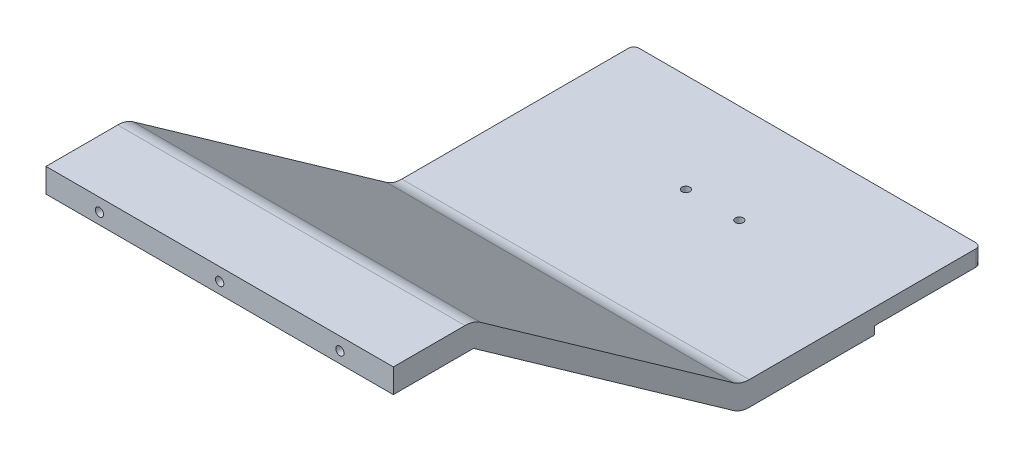
ISO-10303-21;
HEADER;
FILE_DESCRIPTION(('STEP AP214'),'2;1');
FILE_NAME('part.step','',(''),(''),'','','');
FILE_SCHEMA(('AUTOMOTIVE_DESIGN { 1 0 10303 214 1 1 1 1 }'));
ENDSEC;
DATA;
#1=APPLICATION_CONTEXT('core data for automotive mechanical design processes');
#2=APPLICATION_PROTOCOL_DEFINITION('international standard','automotive_design',2000,#1);
#3=PRODUCT_CONTEXT('',#1,'mechanical');
#4=PRODUCT('Part','Part','',(#3));
#5=PRODUCT_RELATED_PRODUCT_CATEGORY('part','',(#4));
#6=PRODUCT_DEFINITION_FORMATION('','',#4);
#7=PRODUCT_DEFINITION_CONTEXT('part definition',#1,'design');
#8=PRODUCT_DEFINITION('design','',#6,#7);
#9=PRODUCT_DEFINITION_SHAPE('','',#8);
#10=(LENGTH_UNIT() NAMED_UNIT(*) SI_UNIT(.MILLI.,.METRE.));
#11=(NAMED_UNIT(*) PLANE_ANGLE_UNIT() SI_UNIT($,.RADIAN.));
#12=(NAMED_UNIT(*) SI_UNIT($,.STERADIAN.) SOLID_ANGLE_UNIT());
#13=UNCERTAINTY_MEASURE_WITH_UNIT(LENGTH_MEASURE(1.E-05),#10,'distance_accuracy_value','');
#14=(GEOMETRIC_REPRESENTATION_CONTEXT(3) GLOBAL_UNCERTAINTY_ASSIGNED_CONTEXT((#13)) GLOBAL_UNIT_ASSIGNED_CONTEXT((#10,
#11,#12)) REPRESENTATION_CONTEXT('',''));
#15=CARTESIAN_POINT('',(0.,0.,0.));
#16=DIRECTION('',(0.,0.,1.));
#17=DIRECTION('',(1.,0.,0.));
#18=AXIS2_PLACEMENT_3D('',#15,#16,#17);
#19=CARTESIAN_POINT('',(209.,70.,-50.));
#20=DIRECTION('',(0.,0.,1.));
#21=DIRECTION('',(1.,0.,0.));
#22=AXIS2_PLACEMENT_3D('',#19,#20,#21);
#23=PLANE('',#22);
#24=DIRECTION('',(0.,1.,0.));
#25=VECTOR('',#24,1.);
#26=CARTESIAN_POINT('',(79.,70.,-50.));
#27=LINE('',#26,#25);
#28=CARTESIAN_POINT('',(79.,70.,-50.));
#29=VERTEX_POINT('',#28);
#30=CARTESIAN_POINT('',(79.,73.,-50.));
#31=VERTEX_POINT('',#30);
#32=EDGE_CURVE('E190',#29,#31,#27,.T.);
#33=ORIENTED_EDGE('',*,*,#32,.T.);
#34=DIRECTION('',(-1.,0.,0.));
#35=VECTOR('',#34,1.);
#36=CARTESIAN_POINT('',(209.,73.,-50.));
#37=LINE('',#36,#35);
#38=CARTESIAN_POINT('',(209.,73.,-50.));
#39=VERTEX_POINT('',#38);
#40=EDGE_CURVE('E252',#39,#31,#37,.T.);
#41=ORIENTED_EDGE('',*,*,#40,.F.);
#42=DIRECTION('',(0.,1.,0.));
#43=VECTOR('',#42,1.);
#44=CARTESIAN_POINT('',(209.,70.,-50.));
#45=LINE('',#44,#43);
#46=CARTESIAN_POINT('',(209.,70.,-50.));
#47=VERTEX_POINT('',#46);
#48=EDGE_CURVE('E198',#47,#39,#45,.T.);
#49=ORIENTED_EDGE('',*,*,#48,.F.);
#50=DIRECTION('',(-1.,0.,0.));
#51=VECTOR('',#50,1.);
#52=CARTESIAN_POINT('',(209.,70.,-50.));
#53=LINE('',#52,#51);
#54=EDGE_CURVE('E212',#47,#29,#53,.T.);
#55=ORIENTED_EDGE('',*,*,#54,.T.);
#56=EDGE_LOOP('',(#33,#41,#49,#55));
#57=FACE_BOUND('',#56,.T.);
#58=ADVANCED_FACE('F57',(#57),#23,.F.);
#59=CARTESIAN_POINT('',(209.,73.,-50.));
#60=DIRECTION('',(0.,1.,0.));
#61=DIRECTION('',(0.,0.,1.));
#62=AXIS2_PLACEMENT_3D('',#59,#60,#61);
#63=PLANE('',#62);
#64=CARTESIAN_POINT('',(135.5,73.,-53.));
#65=DIRECTION('',(0.,-1.,0.));
#66=DIRECTION('',(0.,0.,-1.));
#67=AXIS2_PLACEMENT_3D('',#64,#65,#66);
#68=CIRCLE('',#67,1.5);
#69=CARTESIAN_POINT('',(135.5,73.,-54.5));
#70=VERTEX_POINT('',#69);
#71=EDGE_CURVE('E278',#70,#70,#68,.T.);
#72=ORIENTED_EDGE('',*,*,#71,.F.);
#73=EDGE_LOOP('',(#72));
#74=FACE_BOUND('',#73,.T.);
#75=CARTESIAN_POINT('',(155.5,73.,-53.));
#76=DIRECTION('',(0.,-1.,0.));
#77=DIRECTION('',(0.,0.,-1.));
#78=AXIS2_PLACEMENT_3D('',#75,#76,#77);
#79=CIRCLE('',#78,1.5);
#80=CARTESIAN_POINT('',(155.5,73.,-54.5));
#81=VERTEX_POINT('',#80);
#82=EDGE_CURVE('E557',#81,#81,#79,.T.);
#83=ORIENTED_EDGE('',*,*,#82,.F.);
#84=EDGE_LOOP('',(#83));
#85=FACE_BOUND('',#84,.T.);
#86=DIRECTION('',(-1.,0.,0.));
#87=VECTOR('',#86,1.);
#88=CARTESIAN_POINT('',(209.,73.,-90.));
#89=LINE('',#88,#87);
#90=CARTESIAN_POINT('',(207.,73.,-90.));
#91=VERTEX_POINT('',#90);
#92=CARTESIAN_POINT('',(81.,73.,-90.));
#93=VERTEX_POINT('',#92);
#94=EDGE_CURVE('E247',#91,#93,#89,.T.);
#95=ORIENTED_EDGE('',*,*,#94,.F.);
#96=CARTESIAN_POINT('',(207.,73.,-88.));
#97=DIRECTION('',(0.,1.,0.));
#98=DIRECTION('',(0.,0.,1.));
#99=AXIS2_PLACEMENT_3D('',#96,#97,#98);
#100=CIRCLE('',#99,2.);
#101=CARTESIAN_POINT('',(209.,73.,-88.));
#102=VERTEX_POINT('',#101);
#103=EDGE_CURVE('E266',#91,#102,#100,.F.);
#104=ORIENTED_EDGE('',*,*,#103,.T.);
#105=DIRECTION('',(0.,0.,-1.));
#106=VECTOR('',#105,1.);
#107=CARTESIAN_POINT('',(209.,73.,-50.));
#108=LINE('',#107,#106);
#109=EDGE_CURVE('E200',#39,#102,#108,.T.);
#110=ORIENTED_EDGE('',*,*,#109,.F.);
#111=ORIENTED_EDGE('',*,*,#40,.T.);
#112=DIRECTION('',(0.,0.,-1.));
#113=VECTOR('',#112,1.);
#114=CARTESIAN_POINT('',(79.,73.,-50.));
#115=LINE('',#114,#113);
#116=CARTESIAN_POINT('',(79.,73.,-88.));
#117=VERTEX_POINT('',#116);
#118=EDGE_CURVE('E188',#31,#117,#115,.T.);
#119=ORIENTED_EDGE('',*,*,#118,.T.);
#120=CARTESIAN_POINT('',(81.,73.,-88.));
#121=DIRECTION('',(0.,1.,0.));
#122=DIRECTION('',(0.,0.,1.));
#123=AXIS2_PLACEMENT_3D('',#120,#121,#122);
#124=CIRCLE('',#123,2.);
#125=EDGE_CURVE('E268',#117,#93,#124,.F.);
#126=ORIENTED_EDGE('',*,*,#125,.T.);
#127=EDGE_LOOP('',(#95,#104,#110,#111,#119,#126));
#128=FACE_BOUND('',#127,.T.);
#129=ADVANCED_FACE('F321',(#74,#85,#128),#63,.F.);
#130=CARTESIAN_POINT('',(209.,73.,-90.));
#131=DIRECTION('',(0.,0.,1.));
#132=DIRECTION('',(1.,0.,0.));
#133=AXIS2_PLACEMENT_3D('',#130,#131,#132);
#134=PLANE('',#133);
#135=DIRECTION('',(-1.,0.,0.));
#136=VECTOR('',#135,1.);
#137=CARTESIAN_POINT('',(209.,79.,-90.));
#138=LINE('',#137,#136);
#139=CARTESIAN_POINT('',(207.,79.,-90.));
#140=VERTEX_POINT('',#139);
#141=CARTESIAN_POINT('',(81.,79.,-90.));
#142=VERTEX_POINT('',#141);
#143=EDGE_CURVE('E244',#140,#142,#138,.T.);
#144=ORIENTED_EDGE('',*,*,#143,.F.);
#145=DIRECTION('',(0.,1.,0.));
#146=VECTOR('',#145,1.);
#147=CARTESIAN_POINT('',(207.,73.,-90.));
#148=LINE('',#147,#146);
#149=EDGE_CURVE('E265',#140,#91,#148,.F.);
#150=ORIENTED_EDGE('',*,*,#149,.T.);
#151=ORIENTED_EDGE('',*,*,#94,.T.);
#152=DIRECTION('',(0.,1.,0.));
#153=VECTOR('',#152,1.);
#154=CARTESIAN_POINT('',(81.,73.,-90.));
#155=LINE('',#154,#153);
#156=EDGE_CURVE('E263',#93,#142,#155,.T.);
#157=ORIENTED_EDGE('',*,*,#156,.T.);
#158=EDGE_LOOP('',(#144,#150,#151,#157));
#159=FACE_BOUND('',#158,.T.);
#160=ADVANCED_FACE('F357',(#159),#134,.F.);
#161=CARTESIAN_POINT('',(209.,79.,-90.));
#162=DIRECTION('',(0.,-1.,0.));
#163=DIRECTION('',(0.,0.,-1.));
#164=AXIS2_PLACEMENT_3D('',#161,#162,#163);
#165=PLANE('',#164);
#166=CARTESIAN_POINT('',(135.5,79.,-53.));
#167=DIRECTION('',(0.,-1.,0.));
#168=DIRECTION('',(0.,0.,-1.));
#169=AXIS2_PLACEMENT_3D('',#166,#167,#168);
#170=CIRCLE('',#169,1.5);
#171=CARTESIAN_POINT('',(135.5,79.,-54.5));
#172=VERTEX_POINT('',#171);
#173=EDGE_CURVE('E273',#172,#172,#170,.T.);
#174=ORIENTED_EDGE('',*,*,#173,.T.);
#175=EDGE_LOOP('',(#174));
#176=FACE_BOUND('',#175,.T.);
#177=CARTESIAN_POINT('',(155.5,79.,-53.));
#178=DIRECTION('',(0.,-1.,0.));
#179=DIRECTION('',(0.,0.,-1.));
#180=AXIS2_PLACEMENT_3D('',#177,#178,#179);
#181=CIRCLE('',#180,1.5);
#182=CARTESIAN_POINT('',(155.5,79.,-54.5));
#183=VERTEX_POINT('',#182);
#184=EDGE_CURVE('E275',#183,#183,#181,.T.);
#185=ORIENTED_EDGE('',*,*,#184,.T.);
#186=EDGE_LOOP('',(#185));
#187=FACE_BOUND('',#186,.T.);
#188=DIRECTION('',(0.,0.,1.));
#189=VECTOR('',#188,1.);
#190=CARTESIAN_POINT('',(209.,79.,-90.));
#191=LINE('',#190,#189);
#192=CARTESIAN_POINT('',(209.,79.,-88.));
#193=VERTEX_POINT('',#192);
#194=CARTESIAN_POINT('',(209.,79.,-3.17837245195783));
#195=VERTEX_POINT('',#194);
#196=EDGE_CURVE('E201',#193,#195,#191,.T.);
#197=ORIENTED_EDGE('',*,*,#196,.F.);
#198=CARTESIAN_POINT('',(207.,79.,-88.));
#199=DIRECTION('',(0.,-1.,0.));
#200=DIRECTION('',(0.,0.,-1.));
#201=AXIS2_PLACEMENT_3D('',#198,#199,#200);
#202=CIRCLE('',#201,2.);
#203=EDGE_CURVE('E257',#193,#140,#202,.F.);
#204=ORIENTED_EDGE('',*,*,#203,.T.);
#205=ORIENTED_EDGE('',*,*,#143,.T.);
#206=CARTESIAN_POINT('',(81.,79.,-88.));
#207=DIRECTION('',(0.,-1.,0.));
#208=DIRECTION('',(0.,0.,-1.));
#209=AXIS2_PLACEMENT_3D('',#206,#207,#208);
#210=CIRCLE('',#209,2.);
#211=CARTESIAN_POINT('',(79.,79.,-88.));
#212=VERTEX_POINT('',#211);
#213=EDGE_CURVE('E260',#142,#212,#210,.F.);
#214=ORIENTED_EDGE('',*,*,#213,.T.);
#215=DIRECTION('',(0.,0.,1.));
#216=VECTOR('',#215,1.);
#217=CARTESIAN_POINT('',(79.,79.,-90.));
#218=LINE('',#217,#216);
#219=CARTESIAN_POINT('',(79.,79.,-3.17837245195783));
#220=VERTEX_POINT('',#219);
#221=EDGE_CURVE('E217',#212,#220,#218,.T.);
#222=ORIENTED_EDGE('',*,*,#221,.T.);
#223=DIRECTION('',(-1.,0.,0.));
#224=VECTOR('',#223,1.);
#225=CARTESIAN_POINT('',(209.,79.,-3.17837245195783));
#226=LINE('',#225,#224);
#227=EDGE_CURVE('E245',#195,#220,#226,.T.);
#228=ORIENTED_EDGE('',*,*,#227,.F.);
#229=EDGE_LOOP('',(#197,#204,#205,#214,#222,#228));
#230=FACE_BOUND('',#229,.T.);
#231=ADVANCED_FACE('F335',(#176,#187,#230),#165,.F.);
#232=CARTESIAN_POINT('',(209.,89.,-3.17837245195783));
#233=DIRECTION('',(-1.,0.,0.));
#234=DIRECTION('',(0.,0.,1.));
#235=AXIS2_PLACEMENT_3D('',#232,#233,#234);
#236=CYLINDRICAL_SURFACE('',#235,10.);
#237=CARTESIAN_POINT('',(79.,89.,-3.17837245195783));
#238=DIRECTION('',(-1.,0.,0.));
#239=DIRECTION('',(0.,0.,-1.));
#240=AXIS2_PLACEMENT_3D('',#237,#238,#239);
#241=CIRCLE('',#240,10.);
#242=CARTESIAN_POINT('',(79.,80.8350341907227,2.59513023993843));
#243=VERTEX_POINT('',#242);
#244=EDGE_CURVE('E216',#220,#243,#241,.T.);
#245=ORIENTED_EDGE('',*,*,#244,.T.);
#246=DIRECTION('',(-1.,0.,0.));
#247=VECTOR('',#246,1.);
#248=CARTESIAN_POINT('',(209.,80.8350341907227,2.59513023993843));
#249=LINE('',#248,#247);
#250=CARTESIAN_POINT('',(209.,80.8350341907227,2.59513023993843));
#251=VERTEX_POINT('',#250);
#252=EDGE_CURVE('E237',#251,#243,#249,.T.);
#253=ORIENTED_EDGE('',*,*,#252,.F.);
#254=CARTESIAN_POINT('',(209.,89.,-3.17837245195783));
#255=DIRECTION('',(-1.,0.,0.));
#256=DIRECTION('',(0.,0.,-1.));
#257=AXIS2_PLACEMENT_3D('',#254,#255,#256);
#258=CIRCLE('',#257,10.);
#259=EDGE_CURVE('E202',#195,#251,#258,.T.);
#260=ORIENTED_EDGE('',*,*,#259,.F.);
#261=ORIENTED_EDGE('',*,*,#227,.T.);
#262=EDGE_LOOP('',(#245,#253,#260,#261));
#263=FACE_BOUND('',#262,.T.);
#264=ADVANCED_FACE('F339',(#263),#236,.F.);
#265=CARTESIAN_POINT('',(209.,80.8350341907227,2.59513023993843));
#266=DIRECTION('',(0.,-0.816496580927726,0.577350269189625));
#267=DIRECTION('',(0.,-0.577350269189625,-0.816496580927726));
#268=AXIS2_PLACEMENT_3D('',#265,#266,#267);
#269=PLANE('',#268);
#270=DIRECTION('',(0.,0.577350269189625,0.816496580927726));
#271=VECTOR('',#270,1.);
#272=CARTESIAN_POINT('',(79.,80.8350341907227,2.59513023993843));
#273=LINE('',#272,#271);
#274=CARTESIAN_POINT('',(79.,147.875643927932,97.4048697600616));
#275=VERTEX_POINT('',#274);
#276=EDGE_CURVE('E225',#243,#275,#273,.T.);
#277=ORIENTED_EDGE('',*,*,#276,.T.);
#278=DIRECTION('',(-1.,0.,0.));
#279=VECTOR('',#278,1.);
#280=CARTESIAN_POINT('',(209.,147.875643927932,97.4048697600616));
#281=LINE('',#280,#279);
#282=CARTESIAN_POINT('',(209.,147.875643927932,97.4048697600616));
#283=VERTEX_POINT('',#282);
#284=EDGE_CURVE('E62',#275,#283,#281,.F.);
#285=ORIENTED_EDGE('',*,*,#284,.T.);
#286=DIRECTION('',(0.,0.577350269189625,0.816496580927726));
#287=VECTOR('',#286,1.);
#288=CARTESIAN_POINT('',(209.,80.8350341907227,2.59513023993843));
#289=LINE('',#288,#287);
#290=EDGE_CURVE('E210',#251,#283,#289,.T.);
#291=ORIENTED_EDGE('',*,*,#290,.F.);
#292=ORIENTED_EDGE('',*,*,#252,.T.);
#293=EDGE_LOOP('',(#277,#285,#291,#292));
#294=FACE_BOUND('',#293,.T.);
#295=ADVANCED_FACE('F374',(#294),#269,.F.);
#296=CARTESIAN_POINT('',(209.,140.710678118655,100.));
#297=DIRECTION('',(0.,0.816496580927727,-0.577350269189625));
#298=DIRECTION('',(0.,0.577350269189625,0.816496580927727));
#299=AXIS2_PLACEMENT_3D('',#296,#297,#298);
#300=PLANE('',#299);
#301=DIRECTION('',(0.,-0.577350269189625,-0.816496580927727));
#302=VECTOR('',#301,1.);
#303=CARTESIAN_POINT('',(79.,140.710678118655,100.));
#304=LINE('',#303,#302);
#305=CARTESIAN_POINT('',(79.,140.710678118655,100.));
#306=VERTEX_POINT('',#305);
#307=CARTESIAN_POINT('',(79.,71.8350341907228,2.59513023993842));
#308=VERTEX_POINT('',#307);
#309=EDGE_CURVE('E224',#306,#308,#304,.T.);
#310=ORIENTED_EDGE('',*,*,#309,.T.);
#311=DIRECTION('',(-1.,0.,0.));
#312=VECTOR('',#311,1.);
#313=CARTESIAN_POINT('',(209.,71.8350341907228,2.59513023993842));
#314=LINE('',#313,#312);
#315=CARTESIAN_POINT('',(209.,71.8350341907228,2.59513023993842));
#316=VERTEX_POINT('',#315);
#317=EDGE_CURVE('E234',#316,#308,#314,.T.);
#318=ORIENTED_EDGE('',*,*,#317,.F.);
#319=DIRECTION('',(0.,-0.577350269189625,-0.816496580927727));
#320=VECTOR('',#319,1.);
#321=CARTESIAN_POINT('',(209.,140.710678118655,100.));
#322=LINE('',#321,#320);
#323=CARTESIAN_POINT('',(209.,140.710678118655,100.));
#324=VERTEX_POINT('',#323);
#325=EDGE_CURVE('E209',#324,#316,#322,.T.);
#326=ORIENTED_EDGE('',*,*,#325,.F.);
#327=DIRECTION('',(-1.,0.,0.));
#328=VECTOR('',#327,1.);
#329=CARTESIAN_POINT('',(209.,140.710678118655,100.));
#330=LINE('',#329,#328);
#331=EDGE_CURVE('E240',#324,#306,#330,.T.);
#332=ORIENTED_EDGE('',*,*,#331,.T.);
#333=EDGE_LOOP('',(#310,#318,#326,#332));
#334=FACE_BOUND('',#333,.T.);
#335=ADVANCED_FACE('F304',(#334),#300,.F.);
#336=CARTESIAN_POINT('',(209.,80.,-3.17837245195782));
#337=DIRECTION('',(-1.,0.,0.));
#338=DIRECTION('',(0.,0.,1.));
#339=AXIS2_PLACEMENT_3D('',#336,#337,#338);
#340=CYLINDRICAL_SURFACE('',#339,9.99999999999999);
#341=CARTESIAN_POINT('',(79.,80.,-3.17837245195782));
#342=DIRECTION('',(1.,0.,0.));
#343=DIRECTION('',(0.,0.,-1.));
#344=AXIS2_PLACEMENT_3D('',#341,#342,#343);
#345=CIRCLE('',#344,9.99999999999999);
#346=CARTESIAN_POINT('',(79.,70.,-3.17837245195782));
#347=VERTEX_POINT('',#346);
#348=EDGE_CURVE('E228',#308,#347,#345,.T.);
#349=ORIENTED_EDGE('',*,*,#348,.T.);
#350=DIRECTION('',(-1.,0.,0.));
#351=VECTOR('',#350,1.);
#352=CARTESIAN_POINT('',(209.,70.,-3.17837245195782));
#353=LINE('',#352,#351);
#354=CARTESIAN_POINT('',(209.,70.,-3.17837245195782));
#355=VERTEX_POINT('',#354);
#356=EDGE_CURVE('E233',#355,#347,#353,.T.);
#357=ORIENTED_EDGE('',*,*,#356,.F.);
#358=CARTESIAN_POINT('',(209.,80.,-3.17837245195782));
#359=DIRECTION('',(1.,0.,0.));
#360=DIRECTION('',(0.,0.,-1.));
#361=AXIS2_PLACEMENT_3D('',#358,#359,#360);
#362=CIRCLE('',#361,9.99999999999999);
#363=EDGE_CURVE('E213',#316,#355,#362,.T.);
#364=ORIENTED_EDGE('',*,*,#363,.F.);
#365=ORIENTED_EDGE('',*,*,#317,.T.);
#366=EDGE_LOOP('',(#349,#357,#364,#365));
#367=FACE_BOUND('',#366,.T.);
#368=ADVANCED_FACE('F311',(#367),#340,.T.);
#369=CARTESIAN_POINT('',(209.,70.,-3.17837245195782));
#370=DIRECTION('',(0.,1.,0.));
#371=DIRECTION('',(0.,0.,1.));
#372=AXIS2_PLACEMENT_3D('',#369,#370,#371);
#373=PLANE('',#372);
#374=DIRECTION('',(0.,0.,-1.));
#375=VECTOR('',#374,1.);
#376=CARTESIAN_POINT('',(79.,70.,-3.17837245195782));
#377=LINE('',#376,#375);
#378=EDGE_CURVE('E196',#347,#29,#377,.T.);
#379=ORIENTED_EDGE('',*,*,#378,.T.);
#380=ORIENTED_EDGE('',*,*,#54,.F.);
#381=DIRECTION('',(0.,0.,-1.));
#382=VECTOR('',#381,1.);
#383=CARTESIAN_POINT('',(209.,70.,-3.17837245195782));
#384=LINE('',#383,#382);
#385=EDGE_CURVE('E211',#355,#47,#384,.T.);
#386=ORIENTED_EDGE('',*,*,#385,.F.);
#387=ORIENTED_EDGE('',*,*,#356,.T.);
#388=EDGE_LOOP('',(#379,#380,#386,#387));
#389=FACE_BOUND('',#388,.T.);
#390=ADVANCED_FACE('F314',(#389),#373,.F.);
#391=CARTESIAN_POINT('',(209.,89.,-3.17837245195783));
#392=DIRECTION('',(1.,0.,0.));
#393=DIRECTION('',(0.,0.,-1.));
#394=AXIS2_PLACEMENT_3D('',#391,#392,#393);
#395=PLANE('',#394);
#396=ORIENTED_EDGE('',*,*,#290,.T.);
#397=CARTESIAN_POINT('',(209.,139.710678118655,103.178372451958));
#398=DIRECTION('',(1.,0.,0.));
#399=DIRECTION('',(0.,0.,-1.));
#400=AXIS2_PLACEMENT_3D('',#397,#398,#399);
#401=CIRCLE('',#400,10.);
#402=CARTESIAN_POINT('',(209.,149.710678118655,103.178372451958));
#403=VERTEX_POINT('',#402);
#404=EDGE_CURVE('E12',#283,#403,#401,.T.);
#405=ORIENTED_EDGE('',*,*,#404,.T.);
#406=DIRECTION('',(0.,0.,-1.));
#407=VECTOR('',#406,1.);
#408=CARTESIAN_POINT('',(209.,149.710678118655,130.));
#409=LINE('',#408,#407);
#410=CARTESIAN_POINT('',(209.,149.710678118655,130.));
#411=VERTEX_POINT('',#410);
#412=EDGE_CURVE('E294',#411,#403,#409,.T.);
#413=ORIENTED_EDGE('',*,*,#412,.F.);
#414=DIRECTION('',(0.,1.,0.));
#415=VECTOR('',#414,1.);
#416=CARTESIAN_POINT('',(209.,140.710678118655,130.));
#417=LINE('',#416,#415);
#418=CARTESIAN_POINT('',(209.,140.710678118655,130.));
#419=VERTEX_POINT('',#418);
#420=EDGE_CURVE('E180',#419,#411,#417,.T.);
#421=ORIENTED_EDGE('',*,*,#420,.F.);
#422=DIRECTION('',(0.,0.,-1.));
#423=VECTOR('',#422,1.);
#424=CARTESIAN_POINT('',(209.,140.710678118655,130.));
#425=LINE('',#424,#423);
#426=EDGE_CURVE('E195',#419,#324,#425,.T.);
#427=ORIENTED_EDGE('',*,*,#426,.T.);
#428=ORIENTED_EDGE('',*,*,#325,.T.);
#429=ORIENTED_EDGE('',*,*,#363,.T.);
#430=ORIENTED_EDGE('',*,*,#385,.T.);
#431=ORIENTED_EDGE('',*,*,#48,.T.);
#432=ORIENTED_EDGE('',*,*,#109,.T.);
#433=DIRECTION('',(0.,1.,0.));
#434=VECTOR('',#433,1.);
#435=CARTESIAN_POINT('',(209.,79.,-88.));
#436=LINE('',#435,#434);
#437=EDGE_CURVE('E251',#102,#193,#436,.T.);
#438=ORIENTED_EDGE('',*,*,#437,.T.);
#439=ORIENTED_EDGE('',*,*,#196,.T.);
#440=ORIENTED_EDGE('',*,*,#259,.T.);
#441=EDGE_LOOP('',(#396,#405,#413,#421,#427,#428,#429,#430,#431,#432,#438,#439,#440));
#442=FACE_BOUND('',#441,.T.);
#443=ADVANCED_FACE('F299',(#442),#395,.T.);
#444=CARTESIAN_POINT('',(79.,89.,-3.17837245195783));
#445=DIRECTION('',(1.,0.,0.));
#446=DIRECTION('',(0.,0.,-1.));
#447=AXIS2_PLACEMENT_3D('',#444,#445,#446);
#448=PLANE('',#447);
#449=DIRECTION('',(0.,0.,-1.));
#450=VECTOR('',#449,1.);
#451=CARTESIAN_POINT('',(79.,149.710678118655,130.));
#452=LINE('',#451,#450);
#453=CARTESIAN_POINT('',(79.,149.710678118655,130.));
#454=VERTEX_POINT('',#453);
#455=CARTESIAN_POINT('',(79.,149.710678118655,103.178372451958));
#456=VERTEX_POINT('',#455);
#457=EDGE_CURVE('E164',#454,#456,#452,.T.);
#458=ORIENTED_EDGE('',*,*,#457,.T.);
#459=CARTESIAN_POINT('',(79.,139.710678118655,103.178372451958));
#460=DIRECTION('',(1.,0.,0.));
#461=DIRECTION('',(0.,0.,-1.));
#462=AXIS2_PLACEMENT_3D('',#459,#460,#461);
#463=CIRCLE('',#462,10.);
#464=EDGE_CURVE('E76',#456,#275,#463,.F.);
#465=ORIENTED_EDGE('',*,*,#464,.T.);
#466=ORIENTED_EDGE('',*,*,#276,.F.);
#467=ORIENTED_EDGE('',*,*,#244,.F.);
#468=ORIENTED_EDGE('',*,*,#221,.F.);
#469=DIRECTION('',(0.,1.,0.));
#470=VECTOR('',#469,1.);
#471=CARTESIAN_POINT('',(79.,89.,-88.));
#472=LINE('',#471,#470);
#473=EDGE_CURVE('E267',#212,#117,#472,.F.);
#474=ORIENTED_EDGE('',*,*,#473,.T.);
#475=ORIENTED_EDGE('',*,*,#118,.F.);
#476=ORIENTED_EDGE('',*,*,#32,.F.);
#477=ORIENTED_EDGE('',*,*,#378,.F.);
#478=ORIENTED_EDGE('',*,*,#348,.F.);
#479=ORIENTED_EDGE('',*,*,#309,.F.);
#480=DIRECTION('',(0.,0.,-1.));
#481=VECTOR('',#480,1.);
#482=CARTESIAN_POINT('',(79.,140.710678118655,130.));
#483=LINE('',#482,#481);
#484=CARTESIAN_POINT('',(79.,140.710678118655,130.));
#485=VERTEX_POINT('',#484);
#486=EDGE_CURVE('E166',#485,#306,#483,.T.);
#487=ORIENTED_EDGE('',*,*,#486,.F.);
#488=DIRECTION('',(0.,-1.,0.));
#489=VECTOR('',#488,1.);
#490=CARTESIAN_POINT('',(79.,149.710678118655,130.));
#491=LINE('',#490,#489);
#492=EDGE_CURVE('E163',#454,#485,#491,.T.);
#493=ORIENTED_EDGE('',*,*,#492,.F.);
#494=EDGE_LOOP('',(#458,#465,#466,#467,#468,#474,#475,#476,#477,#478,#479,#487,#493));
#495=FACE_BOUND('',#494,.T.);
#496=ADVANCED_FACE('F161',(#495),#448,.F.);
#497=CARTESIAN_POINT('',(209.,149.710678118655,130.));
#498=DIRECTION('',(0.,-1.,0.));
#499=DIRECTION('',(0.,0.,-1.));
#500=AXIS2_PLACEMENT_3D('',#497,#498,#499);
#501=PLANE('',#500);
#502=ORIENTED_EDGE('',*,*,#412,.T.);
#503=DIRECTION('',(-1.,0.,0.));
#504=VECTOR('',#503,1.);
#505=CARTESIAN_POINT('',(209.,149.710678118655,103.178372451958));
#506=LINE('',#505,#504);
#507=EDGE_CURVE('E187',#403,#456,#506,.T.);
#508=ORIENTED_EDGE('',*,*,#507,.T.);
#509=ORIENTED_EDGE('',*,*,#457,.F.);
#510=DIRECTION('',(-1.,0.,0.));
#511=VECTOR('',#510,1.);
#512=CARTESIAN_POINT('',(209.,149.710678118655,130.));
#513=LINE('',#512,#511);
#514=EDGE_CURVE('E175',#411,#454,#513,.T.);
#515=ORIENTED_EDGE('',*,*,#514,.F.);
#516=EDGE_LOOP('',(#502,#508,#509,#515));
#517=FACE_BOUND('',#516,.T.);
#518=ADVANCED_FACE('F183',(#517),#501,.F.);
#519=CARTESIAN_POINT('',(79.,140.710678118655,130.));
#520=DIRECTION('',(0.,1.,0.));
#521=DIRECTION('',(0.,0.,1.));
#522=AXIS2_PLACEMENT_3D('',#519,#520,#521);
#523=PLANE('',#522);
#524=ORIENTED_EDGE('',*,*,#331,.F.);
#525=ORIENTED_EDGE('',*,*,#426,.F.);
#526=DIRECTION('',(1.,0.,0.));
#527=VECTOR('',#526,1.);
#528=CARTESIAN_POINT('',(79.,140.710678118655,130.));
#529=LINE('',#528,#527);
#530=EDGE_CURVE('E171',#485,#419,#529,.T.);
#531=ORIENTED_EDGE('',*,*,#530,.F.);
#532=ORIENTED_EDGE('',*,*,#486,.T.);
#533=EDGE_LOOP('',(#524,#525,#531,#532));
#534=FACE_BOUND('',#533,.T.);
#535=ADVANCED_FACE('F303',(#534),#523,.F.);
#536=CARTESIAN_POINT('',(0.,0.,130.));
#537=DIRECTION('',(0.,0.,1.));
#538=DIRECTION('',(1.,0.,0.));
#539=AXIS2_PLACEMENT_3D('',#536,#537,#538);
#540=PLANE('',#539);
#541=CARTESIAN_POINT('',(99.,144.890678118655,130.));
#542=DIRECTION('',(0.,0.,1.));
#543=DIRECTION('',(1.,0.,0.));
#544=AXIS2_PLACEMENT_3D('',#541,#542,#543);
#545=CIRCLE('',#544,1.54999999999999);
#546=CARTESIAN_POINT('',(100.55,144.890678118655,130.));
#547=VERTEX_POINT('',#546);
#548=EDGE_CURVE('E555',#547,#547,#545,.T.);
#549=ORIENTED_EDGE('',*,*,#548,.F.);
#550=EDGE_LOOP('',(#549));
#551=FACE_BOUND('',#550,.T.);
#552=CARTESIAN_POINT('',(144.,144.890678118655,130.));
#553=DIRECTION('',(0.,0.,1.));
#554=DIRECTION('',(1.,0.,0.));
#555=AXIS2_PLACEMENT_3D('',#552,#553,#554);
#556=CIRCLE('',#555,1.54999999999999);
#557=CARTESIAN_POINT('',(145.55,144.890678118655,130.));
#558=VERTEX_POINT('',#557);
#559=EDGE_CURVE('E560',#558,#558,#556,.T.);
#560=ORIENTED_EDGE('',*,*,#559,.F.);
#561=EDGE_LOOP('',(#560));
#562=FACE_BOUND('',#561,.T.);
#563=CARTESIAN_POINT('',(189.,144.890678118655,130.));
#564=DIRECTION('',(0.,0.,1.));
#565=DIRECTION('',(1.,0.,0.));
#566=AXIS2_PLACEMENT_3D('',#563,#564,#565);
#567=CIRCLE('',#566,1.54999999999999);
#568=CARTESIAN_POINT('',(190.55,144.890678118655,130.));
#569=VERTEX_POINT('',#568);
#570=EDGE_CURVE('E285',#569,#569,#567,.T.);
#571=ORIENTED_EDGE('',*,*,#570,.F.);
#572=EDGE_LOOP('',(#571));
#573=FACE_BOUND('',#572,.T.);
#574=ORIENTED_EDGE('',*,*,#514,.T.);
#575=ORIENTED_EDGE('',*,*,#492,.T.);
#576=ORIENTED_EDGE('',*,*,#530,.T.);
#577=ORIENTED_EDGE('',*,*,#420,.T.);
#578=EDGE_LOOP('',(#574,#575,#576,#577));
#579=FACE_BOUND('',#578,.T.);
#580=ADVANCED_FACE('F174',(#551,#562,#573,#579),#540,.T.);
#581=CARTESIAN_POINT('',(189.,144.890678118655,125.));
#582=DIRECTION('',(0.,0.,1.));
#583=DIRECTION('',(1.,0.,0.));
#584=AXIS2_PLACEMENT_3D('',#581,#582,#583);
#585=CYLINDRICAL_SURFACE('',#584,1.54999999999999);
#586=CARTESIAN_POINT('',(189.,144.890678118655,125.));
#587=DIRECTION('',(0.,0.,1.));
#588=DIRECTION('',(1.,0.,0.));
#589=AXIS2_PLACEMENT_3D('',#586,#587,#588);
#590=CIRCLE('',#589,1.54999999999999);
#591=CARTESIAN_POINT('',(190.55,144.890678118655,125.));
#592=VERTEX_POINT('',#591);
#593=EDGE_CURVE('E277',#592,#592,#590,.T.);
#594=ORIENTED_EDGE('',*,*,#593,.F.);
#595=EDGE_LOOP('',(#594));
#596=FACE_BOUND('',#595,.T.);
#597=ORIENTED_EDGE('',*,*,#570,.T.);
#598=EDGE_LOOP('',(#597));
#599=FACE_BOUND('',#598,.T.);
#600=ADVANCED_FACE('F502',(#596,#599),#585,.F.);
#601=CARTESIAN_POINT('',(189.,144.890678118655,125.));
#602=DIRECTION('',(0.,0.,1.));
#603=DIRECTION('',(1.,0.,0.));
#604=AXIS2_PLACEMENT_3D('',#601,#602,#603);
#605=PLANE('',#604);
#606=ORIENTED_EDGE('',*,*,#593,.T.);
#607=EDGE_LOOP('',(#606));
#608=FACE_BOUND('',#607,.T.);
#609=ADVANCED_FACE('F514',(#608),#605,.T.);
#610=CARTESIAN_POINT('',(144.,144.890678118655,125.));
#611=DIRECTION('',(0.,0.,1.));
#612=DIRECTION('',(1.,0.,0.));
#613=AXIS2_PLACEMENT_3D('',#610,#611,#612);
#614=CYLINDRICAL_SURFACE('',#613,1.54999999999999);
#615=CARTESIAN_POINT('',(144.,144.890678118655,125.));
#616=DIRECTION('',(0.,0.,1.));
#617=DIRECTION('',(1.,0.,0.));
#618=AXIS2_PLACEMENT_3D('',#615,#616,#617);
#619=CIRCLE('',#618,1.54999999999999);
#620=CARTESIAN_POINT('',(145.55,144.890678118655,125.));
#621=VERTEX_POINT('',#620);
#622=EDGE_CURVE('E289',#621,#621,#619,.T.);
#623=ORIENTED_EDGE('',*,*,#622,.F.);
#624=EDGE_LOOP('',(#623));
#625=FACE_BOUND('',#624,.T.);
#626=ORIENTED_EDGE('',*,*,#559,.T.);
#627=EDGE_LOOP('',(#626));
#628=FACE_BOUND('',#627,.T.);
#629=ADVANCED_FACE('F524',(#625,#628),#614,.F.);
#630=CARTESIAN_POINT('',(144.,144.890678118655,125.));
#631=DIRECTION('',(0.,0.,1.));
#632=DIRECTION('',(1.,0.,0.));
#633=AXIS2_PLACEMENT_3D('',#630,#631,#632);
#634=PLANE('',#633);
#635=ORIENTED_EDGE('',*,*,#622,.T.);
#636=EDGE_LOOP('',(#635));
#637=FACE_BOUND('',#636,.T.);
#638=ADVANCED_FACE('F527',(#637),#634,.T.);
#639=CARTESIAN_POINT('',(99.,144.890678118655,125.));
#640=DIRECTION('',(0.,0.,1.));
#641=DIRECTION('',(1.,0.,0.));
#642=AXIS2_PLACEMENT_3D('',#639,#640,#641);
#643=CYLINDRICAL_SURFACE('',#642,1.54999999999999);
#644=CARTESIAN_POINT('',(99.,144.890678118655,125.));
#645=DIRECTION('',(0.,0.,1.));
#646=DIRECTION('',(1.,0.,0.));
#647=AXIS2_PLACEMENT_3D('',#644,#645,#646);
#648=CIRCLE('',#647,1.54999999999999);
#649=CARTESIAN_POINT('',(100.55,144.890678118655,125.));
#650=VERTEX_POINT('',#649);
#651=EDGE_CURVE('E181',#650,#650,#648,.T.);
#652=ORIENTED_EDGE('',*,*,#651,.F.);
#653=EDGE_LOOP('',(#652));
#654=FACE_BOUND('',#653,.T.);
#655=ORIENTED_EDGE('',*,*,#548,.T.);
#656=EDGE_LOOP('',(#655));
#657=FACE_BOUND('',#656,.T.);
#658=ADVANCED_FACE('F537',(#654,#657),#643,.F.);
#659=CARTESIAN_POINT('',(99.,144.890678118655,125.));
#660=DIRECTION('',(0.,0.,1.));
#661=DIRECTION('',(1.,0.,0.));
#662=AXIS2_PLACEMENT_3D('',#659,#660,#661);
#663=PLANE('',#662);
#664=ORIENTED_EDGE('',*,*,#651,.T.);
#665=EDGE_LOOP('',(#664));
#666=FACE_BOUND('',#665,.T.);
#667=ADVANCED_FACE('F364',(#666),#663,.T.);
#668=CARTESIAN_POINT('',(207.,89.,-88.));
#669=DIRECTION('',(0.,-1.,0.));
#670=DIRECTION('',(0.,0.,-1.));
#671=AXIS2_PLACEMENT_3D('',#668,#669,#670);
#672=CYLINDRICAL_SURFACE('',#671,2.);
#673=ORIENTED_EDGE('',*,*,#103,.F.);
#674=ORIENTED_EDGE('',*,*,#149,.F.);
#675=ORIENTED_EDGE('',*,*,#203,.F.);
#676=ORIENTED_EDGE('',*,*,#437,.F.);
#677=EDGE_LOOP('',(#673,#674,#675,#676));
#678=FACE_BOUND('',#677,.T.);
#679=ADVANCED_FACE('F327',(#678),#672,.T.);
#680=CARTESIAN_POINT('',(81.,73.,-88.));
#681=DIRECTION('',(0.,1.,0.));
#682=DIRECTION('',(0.,0.,1.));
#683=AXIS2_PLACEMENT_3D('',#680,#681,#682);
#684=CYLINDRICAL_SURFACE('',#683,2.);
#685=ORIENTED_EDGE('',*,*,#125,.F.);
#686=ORIENTED_EDGE('',*,*,#473,.F.);
#687=ORIENTED_EDGE('',*,*,#213,.F.);
#688=ORIENTED_EDGE('',*,*,#156,.F.);
#689=EDGE_LOOP('',(#685,#686,#687,#688));
#690=FACE_BOUND('',#689,.T.);
#691=ADVANCED_FACE('F361',(#690),#684,.T.);
#692=CARTESIAN_POINT('',(155.5,149.710678118655,-53.));
#693=DIRECTION('',(0.,-1.,0.));
#694=DIRECTION('',(0.,0.,-1.));
#695=AXIS2_PLACEMENT_3D('',#692,#693,#694);
#696=CYLINDRICAL_SURFACE('',#695,1.5);
#697=CARTESIAN_POINT('',(155.5,73.,-54.5));
#698=CARTESIAN_POINT('',(155.5,73.0625,-54.5));
#699=CARTESIAN_POINT('',(155.5,73.125,-54.5));
#700=CARTESIAN_POINT('',(155.5,73.25,-54.5));
#701=CARTESIAN_POINT('',(155.5,73.3125,-54.5));
#702=CARTESIAN_POINT('',(155.5,73.4375,-54.5));
#703=CARTESIAN_POINT('',(155.5,73.5,-54.5));
#704=CARTESIAN_POINT('',(155.5,73.625,-54.5));
#705=CARTESIAN_POINT('',(155.5,73.6875,-54.5));
#706=CARTESIAN_POINT('',(155.5,73.8125,-54.5));
#707=CARTESIAN_POINT('',(155.5,73.875,-54.5));
#708=CARTESIAN_POINT('',(155.5,74.,-54.5));
#709=CARTESIAN_POINT('',(155.5,74.0625,-54.5));
#710=CARTESIAN_POINT('',(155.5,74.1875,-54.5));
#711=CARTESIAN_POINT('',(155.5,74.25,-54.5));
#712=CARTESIAN_POINT('',(155.5,74.375,-54.5));
#713=CARTESIAN_POINT('',(155.5,74.4375,-54.5));
#714=CARTESIAN_POINT('',(155.5,74.5625,-54.5));
#715=CARTESIAN_POINT('',(155.5,74.625,-54.5));
#716=CARTESIAN_POINT('',(155.5,74.75,-54.5));
#717=CARTESIAN_POINT('',(155.5,74.8125,-54.5));
#718=CARTESIAN_POINT('',(155.5,74.9375,-54.5));
#719=CARTESIAN_POINT('',(155.5,75.,-54.5));
#720=CARTESIAN_POINT('',(155.5,75.125,-54.5));
#721=CARTESIAN_POINT('',(155.5,75.1875,-54.5));
#722=CARTESIAN_POINT('',(155.5,75.3125,-54.5));
#723=CARTESIAN_POINT('',(155.5,75.375,-54.5));
#724=CARTESIAN_POINT('',(155.5,75.5,-54.5));
#725=CARTESIAN_POINT('',(155.5,75.5625,-54.5));
#726=CARTESIAN_POINT('',(155.5,75.6875,-54.5));
#727=CARTESIAN_POINT('',(155.5,75.75,-54.5));
#728=CARTESIAN_POINT('',(155.5,75.875,-54.5));
#729=CARTESIAN_POINT('',(155.5,75.9375,-54.5));
#730=CARTESIAN_POINT('',(155.5,76.0625,-54.5));
#731=CARTESIAN_POINT('',(155.5,76.125,-54.5));
#732=CARTESIAN_POINT('',(155.5,76.25,-54.5));
#733=CARTESIAN_POINT('',(155.5,76.3125,-54.5));
#734=CARTESIAN_POINT('',(155.5,76.4375,-54.5));
#735=CARTESIAN_POINT('',(155.5,76.5,-54.5));
#736=CARTESIAN_POINT('',(155.5,76.625,-54.5));
#737=CARTESIAN_POINT('',(155.5,76.6875,-54.5));
#738=CARTESIAN_POINT('',(155.5,76.8125,-54.5));
#739=CARTESIAN_POINT('',(155.5,76.875,-54.5));
#740=CARTESIAN_POINT('',(155.5,77.,-54.5));
#741=CARTESIAN_POINT('',(155.5,77.0625,-54.5));
#742=CARTESIAN_POINT('',(155.5,77.1875,-54.5));
#743=CARTESIAN_POINT('',(155.5,77.25,-54.5));
#744=CARTESIAN_POINT('',(155.5,77.375,-54.5));
#745=CARTESIAN_POINT('',(155.5,77.4375,-54.5));
#746=CARTESIAN_POINT('',(155.5,77.5625,-54.5));
#747=CARTESIAN_POINT('',(155.5,77.625,-54.5));
#748=CARTESIAN_POINT('',(155.5,77.75,-54.5));
#749=CARTESIAN_POINT('',(155.5,77.8125,-54.5));
#750=CARTESIAN_POINT('',(155.5,77.9375,-54.5));
#751=CARTESIAN_POINT('',(155.5,78.,-54.5));
#752=CARTESIAN_POINT('',(155.5,78.125,-54.5));
#753=CARTESIAN_POINT('',(155.5,78.1875,-54.5));
#754=CARTESIAN_POINT('',(155.5,78.3125,-54.5));
#755=CARTESIAN_POINT('',(155.5,78.375,-54.5));
#756=CARTESIAN_POINT('',(155.5,78.5,-54.5));
#757=CARTESIAN_POINT('',(155.5,78.5625,-54.5));
#758=CARTESIAN_POINT('',(155.5,78.6875,-54.5));
#759=CARTESIAN_POINT('',(155.5,78.75,-54.5));
#760=CARTESIAN_POINT('',(155.5,78.875,-54.5));
#761=CARTESIAN_POINT('',(155.5,78.9375,-54.5));
#762=CARTESIAN_POINT('',(155.5,79.,-54.5));
#763=B_SPLINE_CURVE_WITH_KNOTS('',3,(#697,#698,#699,#700,#701,#702,#703,#704,#705,#706,#707,
#708,#709,#710,#711,#712,#713,#714,#715,#716,#717,#718,#719,#720,#721,#722,#723,#724,#725,#726,
#727,#728,#729,#730,#731,#732,#733,#734,#735,#736,#737,#738,#739,#740,#741,#742,#743,#744,#745,
#746,#747,#748,#749,#750,#751,#752,#753,#754,#755,#756,#757,#758,#759,#760,#761,#762),
.UNSPECIFIED.,.F.,.F.,(4,2,2,2,2,2,2,2,2,2,2,2,2,2,2,2,2,2,2,2,2,2,2,2,2,2,2,2,2,2,2,2,4),(0.,
0.187500000000007,0.375,0.562500000000007,0.750000000000001,0.937500000000008,1.125,
1.31250000000001,1.5,1.68750000000001,1.87500000000002,2.06250000000001,2.25000000000002,
2.43750000000001,2.62500000000002,2.81250000000001,3.00000000000002,3.18750000000002,
3.37500000000002,3.56250000000002,3.75000000000002,3.93750000000002,4.12500000000002,
4.31250000000002,4.50000000000003,4.68750000000002,4.87500000000003,5.06250000000002,
5.25000000000003,5.43750000000003,5.62500000000003,5.81250000000003,6.00000000000003),.UNSPECIFIED.);
#764=EDGE_CURVE('BSEAM347',#81,#183,#763,.T.);
#765=ORIENTED_EDGE('',*,*,#82,.T.);
#766=ORIENTED_EDGE('',*,*,#184,.F.);
#767=ORIENTED_EDGE('',*,*,#764,.T.);
#768=ORIENTED_EDGE('',*,*,#764,.F.);
#769=EDGE_LOOP('',(#765,#767,#766,#768));
#770=FACE_BOUND('',#769,.T.);
#771=ADVANCED_FACE('F347',(#770),#696,.F.);
#772=CARTESIAN_POINT('',(135.5,149.710678118655,-53.));
#773=DIRECTION('',(0.,-1.,0.));
#774=DIRECTION('',(0.,0.,-1.));
#775=AXIS2_PLACEMENT_3D('',#772,#773,#774);
#776=CYLINDRICAL_SURFACE('',#775,1.5);
#777=CARTESIAN_POINT('',(135.5,73.,-54.5));
#778=CARTESIAN_POINT('',(135.5,73.0625,-54.5));
#779=CARTESIAN_POINT('',(135.5,73.125,-54.5));
#780=CARTESIAN_POINT('',(135.5,73.25,-54.5));
#781=CARTESIAN_POINT('',(135.5,73.3125,-54.5));
#782=CARTESIAN_POINT('',(135.5,73.4375,-54.5));
#783=CARTESIAN_POINT('',(135.5,73.5,-54.5));
#784=CARTESIAN_POINT('',(135.5,73.625,-54.5));
#785=CARTESIAN_POINT('',(135.5,73.6875,-54.5));
#786=CARTESIAN_POINT('',(135.5,73.8125,-54.5));
#787=CARTESIAN_POINT('',(135.5,73.875,-54.5));
#788=CARTESIAN_POINT('',(135.5,74.,-54.5));
#789=CARTESIAN_POINT('',(135.5,74.0625,-54.5));
#790=CARTESIAN_POINT('',(135.5,74.1875,-54.5));
#791=CARTESIAN_POINT('',(135.5,74.25,-54.5));
#792=CARTESIAN_POINT('',(135.5,74.375,-54.5));
#793=CARTESIAN_POINT('',(135.5,74.4375,-54.5));
#794=CARTESIAN_POINT('',(135.5,74.5625,-54.5));
#795=CARTESIAN_POINT('',(135.5,74.625,-54.5));
#796=CARTESIAN_POINT('',(135.5,74.75,-54.5));
#797=CARTESIAN_POINT('',(135.5,74.8125,-54.5));
#798=CARTESIAN_POINT('',(135.5,74.9375,-54.5));
#799=CARTESIAN_POINT('',(135.5,75.,-54.5));
#800=CARTESIAN_POINT('',(135.5,75.125,-54.5));
#801=CARTESIAN_POINT('',(135.5,75.1875,-54.5));
#802=CARTESIAN_POINT('',(135.5,75.3125,-54.5));
#803=CARTESIAN_POINT('',(135.5,75.375,-54.5));
#804=CARTESIAN_POINT('',(135.5,75.5,-54.5));
#805=CARTESIAN_POINT('',(135.5,75.5625,-54.5));
#806=CARTESIAN_POINT('',(135.5,75.6875,-54.5));
#807=CARTESIAN_POINT('',(135.5,75.75,-54.5));
#808=CARTESIAN_POINT('',(135.5,75.875,-54.5));
#809=CARTESIAN_POINT('',(135.5,75.9375,-54.5));
#810=CARTESIAN_POINT('',(135.5,76.0625,-54.5));
#811=CARTESIAN_POINT('',(135.5,76.125,-54.5));
#812=CARTESIAN_POINT('',(135.5,76.25,-54.5));
#813=CARTESIAN_POINT('',(135.5,76.3125,-54.5));
#814=CARTESIAN_POINT('',(135.5,76.4375,-54.5));
#815=CARTESIAN_POINT('',(135.5,76.5,-54.5));
#816=CARTESIAN_POINT('',(135.5,76.625,-54.5));
#817=CARTESIAN_POINT('',(135.5,76.6875,-54.5));
#818=CARTESIAN_POINT('',(135.5,76.8125,-54.5));
#819=CARTESIAN_POINT('',(135.5,76.875,-54.5));
#820=CARTESIAN_POINT('',(135.5,77.,-54.5));
#821=CARTESIAN_POINT('',(135.5,77.0625,-54.5));
#822=CARTESIAN_POINT('',(135.5,77.1875,-54.5));
#823=CARTESIAN_POINT('',(135.5,77.25,-54.5));
#824=CARTESIAN_POINT('',(135.5,77.375,-54.5));
#825=CARTESIAN_POINT('',(135.5,77.4375,-54.5));
#826=CARTESIAN_POINT('',(135.5,77.5625,-54.5));
#827=CARTESIAN_POINT('',(135.5,77.625,-54.5));
#828=CARTESIAN_POINT('',(135.5,77.75,-54.5));
#829=CARTESIAN_POINT('',(135.5,77.8125,-54.5));
#830=CARTESIAN_POINT('',(135.5,77.9375,-54.5));
#831=CARTESIAN_POINT('',(135.5,78.,-54.5));
#832=CARTESIAN_POINT('',(135.5,78.125,-54.5));
#833=CARTESIAN_POINT('',(135.5,78.1875,-54.5));
#834=CARTESIAN_POINT('',(135.5,78.3125,-54.5));
#835=CARTESIAN_POINT('',(135.5,78.375,-54.5));
#836=CARTESIAN_POINT('',(135.5,78.5,-54.5));
#837=CARTESIAN_POINT('',(135.5,78.5625,-54.5));
#838=CARTESIAN_POINT('',(135.5,78.6875,-54.5));
#839=CARTESIAN_POINT('',(135.5,78.75,-54.5));
#840=CARTESIAN_POINT('',(135.5,78.875,-54.5));
#841=CARTESIAN_POINT('',(135.5,78.9375,-54.5));
#842=CARTESIAN_POINT('',(135.5,79.,-54.5));
#843=B_SPLINE_CURVE_WITH_KNOTS('',3,(#777,#778,#779,#780,#781,#782,#783,#784,#785,#786,#787,
#788,#789,#790,#791,#792,#793,#794,#795,#796,#797,#798,#799,#800,#801,#802,#803,#804,#805,#806,
#807,#808,#809,#810,#811,#812,#813,#814,#815,#816,#817,#818,#819,#820,#821,#822,#823,#824,#825,
#826,#827,#828,#829,#830,#831,#832,#833,#834,#835,#836,#837,#838,#839,#840,#841,#842),
.UNSPECIFIED.,.F.,.F.,(4,2,2,2,2,2,2,2,2,2,2,2,2,2,2,2,2,2,2,2,2,2,2,2,2,2,2,2,2,2,2,2,4),(0.,
0.187500000000007,0.375,0.562500000000007,0.750000000000001,0.937500000000008,1.125,
1.31250000000001,1.5,1.68750000000001,1.87500000000002,2.06250000000001,2.25000000000002,
2.43750000000001,2.62500000000002,2.81250000000001,3.00000000000002,3.18750000000002,
3.37500000000002,3.56250000000002,3.75000000000002,3.93750000000002,4.12500000000002,
4.31250000000002,4.50000000000003,4.68750000000002,4.87500000000003,5.06250000000002,
5.25000000000003,5.43750000000003,5.62500000000003,5.81250000000003,6.00000000000003),.UNSPECIFIED.);
#844=EDGE_CURVE('BSEAM341',#70,#172,#843,.T.);
#845=ORIENTED_EDGE('',*,*,#71,.T.);
#846=ORIENTED_EDGE('',*,*,#173,.F.);
#847=ORIENTED_EDGE('',*,*,#844,.T.);
#848=ORIENTED_EDGE('',*,*,#844,.F.);
#849=EDGE_LOOP('',(#845,#847,#846,#848));
#850=FACE_BOUND('',#849,.T.);
#851=ADVANCED_FACE('F341',(#850),#776,.F.);
#852=CARTESIAN_POINT('',(209.,139.710678118655,103.178372451958));
#853=DIRECTION('',(-1.,0.,0.));
#854=DIRECTION('',(0.,0.,1.));
#855=AXIS2_PLACEMENT_3D('',#852,#853,#854);
#856=CYLINDRICAL_SURFACE('',#855,10.);
#857=ORIENTED_EDGE('',*,*,#404,.F.);
#858=ORIENTED_EDGE('',*,*,#284,.F.);
#859=ORIENTED_EDGE('',*,*,#464,.F.);
#860=ORIENTED_EDGE('',*,*,#507,.F.);
#861=EDGE_LOOP('',(#857,#858,#859,#860));
#862=FACE_BOUND('',#861,.T.);
#863=ADVANCED_FACE('F59',(#862),#856,.T.);
#864=CLOSED_SHELL('',(#58,#129,#160,#231,#264,#295,#335,#368,#390,#443,#496,#518,#535,#580,#600,
#609,#629,#638,#658,#667,#679,#691,#771,#851,#863));
#865=MANIFOLD_SOLID_BREP('B2',#864);
#866=ADVANCED_BREP_SHAPE_REPRESENTATION('',(#18,#865),#14);
#867=SHAPE_DEFINITION_REPRESENTATION(#9,#866);
ENDSEC;
END-ISO-10303-21;
